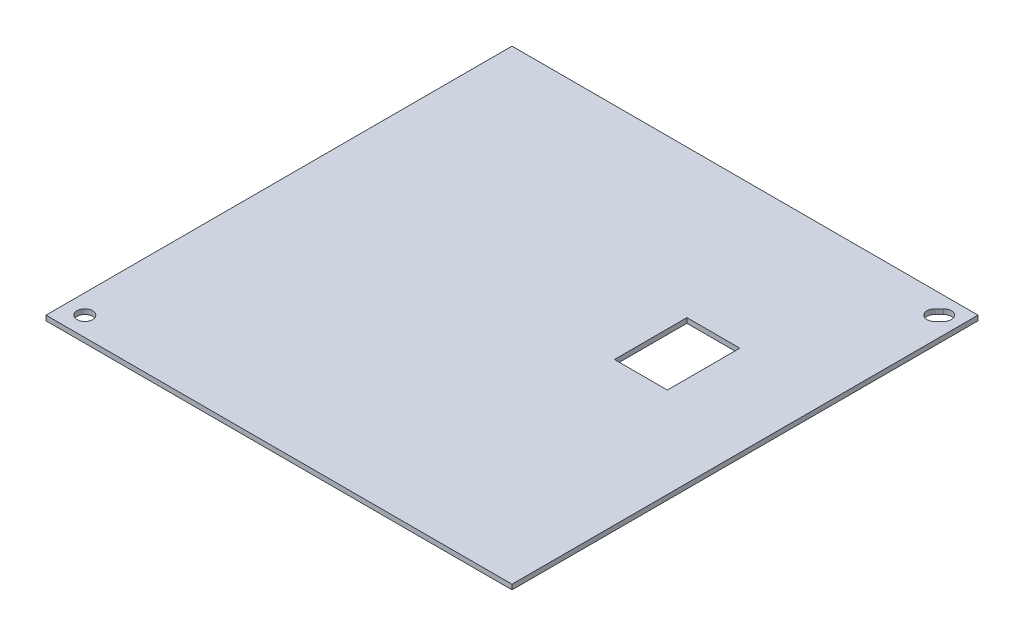
ISO-10303-21;
HEADER;
FILE_DESCRIPTION(('STEP AP214'),'2;1');
FILE_NAME('part.step','',(''),(''),'','','');
FILE_SCHEMA(('AUTOMOTIVE_DESIGN { 1 0 10303 214 1 1 1 1 }'));
ENDSEC;
DATA;
#1=APPLICATION_CONTEXT('core data for automotive mechanical design processes');
#2=APPLICATION_PROTOCOL_DEFINITION('international standard','automotive_design',2000,#1);
#3=PRODUCT_CONTEXT('',#1,'mechanical');
#4=PRODUCT('Part','Part','',(#3));
#5=PRODUCT_RELATED_PRODUCT_CATEGORY('part','',(#4));
#6=PRODUCT_DEFINITION_FORMATION('','',#4);
#7=PRODUCT_DEFINITION_CONTEXT('part definition',#1,'design');
#8=PRODUCT_DEFINITION('design','',#6,#7);
#9=PRODUCT_DEFINITION_SHAPE('','',#8);
#10=(LENGTH_UNIT() NAMED_UNIT(*) SI_UNIT(.MILLI.,.METRE.));
#11=(NAMED_UNIT(*) PLANE_ANGLE_UNIT() SI_UNIT($,.RADIAN.));
#12=(NAMED_UNIT(*) SI_UNIT($,.STERADIAN.) SOLID_ANGLE_UNIT());
#13=UNCERTAINTY_MEASURE_WITH_UNIT(LENGTH_MEASURE(1.E-05),#10,'distance_accuracy_value','');
#14=(GEOMETRIC_REPRESENTATION_CONTEXT(3) GLOBAL_UNCERTAINTY_ASSIGNED_CONTEXT((#13)) GLOBAL_UNIT_ASSIGNED_CONTEXT((#10,
#11,#12)) REPRESENTATION_CONTEXT('',''));
#15=CARTESIAN_POINT('',(0.,0.,0.));
#16=DIRECTION('',(0.,0.,1.));
#17=DIRECTION('',(1.,0.,0.));
#18=AXIS2_PLACEMENT_3D('',#15,#16,#17);
#19=CARTESIAN_POINT('',(150.,3.175,150.));
#20=DIRECTION('',(-1.,0.,0.));
#21=DIRECTION('',(0.,0.,1.));
#22=AXIS2_PLACEMENT_3D('',#19,#20,#21);
#23=PLANE('',#22);
#24=DIRECTION('',(0.,0.,-1.));
#25=VECTOR('',#24,1.);
#26=CARTESIAN_POINT('',(150.,0.,150.));
#27=LINE('',#26,#25);
#28=CARTESIAN_POINT('',(150.,0.,150.));
#29=VERTEX_POINT('',#28);
#30=CARTESIAN_POINT('',(150.,0.,-150.));
#31=VERTEX_POINT('',#30);
#32=EDGE_CURVE('E173',#29,#31,#27,.T.);
#33=ORIENTED_EDGE('',*,*,#32,.T.);
#34=DIRECTION('',(0.,-1.,0.));
#35=VECTOR('',#34,1.);
#36=CARTESIAN_POINT('',(150.,3.175,-150.));
#37=LINE('',#36,#35);
#38=CARTESIAN_POINT('',(150.,3.175,-150.));
#39=VERTEX_POINT('',#38);
#40=EDGE_CURVE('E11',#39,#31,#37,.T.);
#41=ORIENTED_EDGE('',*,*,#40,.F.);
#42=DIRECTION('',(0.,0.,-1.));
#43=VECTOR('',#42,1.);
#44=CARTESIAN_POINT('',(150.,3.175,150.));
#45=LINE('',#44,#43);
#46=CARTESIAN_POINT('',(150.,3.175,150.));
#47=VERTEX_POINT('',#46);
#48=EDGE_CURVE('E208',#47,#39,#45,.T.);
#49=ORIENTED_EDGE('',*,*,#48,.F.);
#50=DIRECTION('',(0.,-1.,0.));
#51=VECTOR('',#50,1.);
#52=CARTESIAN_POINT('',(150.,3.175,150.));
#53=LINE('',#52,#51);
#54=EDGE_CURVE('E218',#47,#29,#53,.T.);
#55=ORIENTED_EDGE('',*,*,#54,.T.);
#56=EDGE_LOOP('',(#33,#41,#49,#55));
#57=FACE_BOUND('',#56,.T.);
#58=ADVANCED_FACE('F45',(#57),#23,.F.);
#59=CARTESIAN_POINT('',(-150.,3.175,-150.));
#60=DIRECTION('',(0.,0.,1.));
#61=DIRECTION('',(1.,0.,0.));
#62=AXIS2_PLACEMENT_3D('',#59,#60,#61);
#63=PLANE('',#62);
#64=DIRECTION('',(-1.,0.,0.));
#65=VECTOR('',#64,1.);
#66=CARTESIAN_POINT('',(-150.,0.,-150.));
#67=LINE('',#66,#65);
#68=CARTESIAN_POINT('',(-150.,0.,-150.));
#69=VERTEX_POINT('',#68);
#70=EDGE_CURVE('E221',#31,#69,#67,.T.);
#71=ORIENTED_EDGE('',*,*,#70,.T.);
#72=DIRECTION('',(0.,-1.,0.));
#73=VECTOR('',#72,1.);
#74=CARTESIAN_POINT('',(-150.,3.175,-150.));
#75=LINE('',#74,#73);
#76=CARTESIAN_POINT('',(-150.,3.175,-150.));
#77=VERTEX_POINT('',#76);
#78=EDGE_CURVE('E52',#77,#69,#75,.T.);
#79=ORIENTED_EDGE('',*,*,#78,.F.);
#80=DIRECTION('',(-1.,0.,0.));
#81=VECTOR('',#80,1.);
#82=CARTESIAN_POINT('',(-150.,3.175,-150.));
#83=LINE('',#82,#81);
#84=EDGE_CURVE('E211',#39,#77,#83,.T.);
#85=ORIENTED_EDGE('',*,*,#84,.F.);
#86=ORIENTED_EDGE('',*,*,#40,.T.);
#87=EDGE_LOOP('',(#71,#79,#85,#86));
#88=FACE_BOUND('',#87,.T.);
#89=ADVANCED_FACE('F250',(#88),#63,.F.);
#90=CARTESIAN_POINT('',(-150.,3.175,150.));
#91=DIRECTION('',(1.,0.,0.));
#92=DIRECTION('',(0.,0.,-1.));
#93=AXIS2_PLACEMENT_3D('',#90,#91,#92);
#94=PLANE('',#93);
#95=DIRECTION('',(0.,0.,1.));
#96=VECTOR('',#95,1.);
#97=CARTESIAN_POINT('',(-150.,0.,150.));
#98=LINE('',#97,#96);
#99=CARTESIAN_POINT('',(-150.,0.,150.));
#100=VERTEX_POINT('',#99);
#101=EDGE_CURVE('E223',#69,#100,#98,.T.);
#102=ORIENTED_EDGE('',*,*,#101,.T.);
#103=DIRECTION('',(0.,-1.,0.));
#104=VECTOR('',#103,1.);
#105=CARTESIAN_POINT('',(-150.,3.175,150.));
#106=LINE('',#105,#104);
#107=CARTESIAN_POINT('',(-150.,3.175,150.));
#108=VERTEX_POINT('',#107);
#109=EDGE_CURVE('E228',#108,#100,#106,.T.);
#110=ORIENTED_EDGE('',*,*,#109,.F.);
#111=DIRECTION('',(0.,0.,1.));
#112=VECTOR('',#111,1.);
#113=CARTESIAN_POINT('',(-150.,3.175,150.));
#114=LINE('',#113,#112);
#115=EDGE_CURVE('E214',#77,#108,#114,.T.);
#116=ORIENTED_EDGE('',*,*,#115,.F.);
#117=ORIENTED_EDGE('',*,*,#78,.T.);
#118=EDGE_LOOP('',(#102,#110,#116,#117));
#119=FACE_BOUND('',#118,.T.);
#120=ADVANCED_FACE('F235',(#119),#94,.F.);
#121=CARTESIAN_POINT('',(-150.,3.175,150.));
#122=DIRECTION('',(0.,0.,-1.));
#123=DIRECTION('',(-1.,0.,0.));
#124=AXIS2_PLACEMENT_3D('',#121,#122,#123);
#125=PLANE('',#124);
#126=DIRECTION('',(1.,0.,0.));
#127=VECTOR('',#126,1.);
#128=CARTESIAN_POINT('',(-150.,0.,150.));
#129=LINE('',#128,#127);
#130=EDGE_CURVE('E212',#100,#29,#129,.T.);
#131=ORIENTED_EDGE('',*,*,#130,.T.);
#132=ORIENTED_EDGE('',*,*,#54,.F.);
#133=DIRECTION('',(1.,0.,0.));
#134=VECTOR('',#133,1.);
#135=CARTESIAN_POINT('',(-150.,3.175,150.));
#136=LINE('',#135,#134);
#137=EDGE_CURVE('E216',#108,#47,#136,.T.);
#138=ORIENTED_EDGE('',*,*,#137,.F.);
#139=ORIENTED_EDGE('',*,*,#109,.T.);
#140=EDGE_LOOP('',(#131,#132,#138,#139));
#141=FACE_BOUND('',#140,.T.);
#142=ADVANCED_FACE('F243',(#141),#125,.F.);
#143=CARTESIAN_POINT('',(0.,3.175,0.));
#144=DIRECTION('',(0.,-1.,0.));
#145=DIRECTION('',(0.,0.,-1.));
#146=AXIS2_PLACEMENT_3D('',#143,#144,#145);
#147=PLANE('',#146);
#148=DIRECTION('',(-1.,0.,0.));
#149=VECTOR('',#148,1.);
#150=CARTESIAN_POINT('',(57.6860126322791,3.175,-54.9271411369051));
#151=LINE('',#150,#149);
#152=CARTESIAN_POINT('',(91.7460126322791,3.175,-54.9271411369051));
#153=VERTEX_POINT('',#152);
#154=CARTESIAN_POINT('',(57.6860126322791,3.175,-54.9271411369051));
#155=VERTEX_POINT('',#154);
#156=EDGE_CURVE('E160',#153,#155,#151,.T.);
#157=ORIENTED_EDGE('',*,*,#156,.F.);
#158=DIRECTION('',(0.,0.,-1.));
#159=VECTOR('',#158,1.);
#160=CARTESIAN_POINT('',(91.7460126322791,3.175,-8.25714113690512));
#161=LINE('',#160,#159);
#162=CARTESIAN_POINT('',(91.7460126322791,3.175,-8.25714113690512));
#163=VERTEX_POINT('',#162);
#164=EDGE_CURVE('E59',#163,#153,#161,.T.);
#165=ORIENTED_EDGE('',*,*,#164,.F.);
#166=DIRECTION('',(1.,0.,0.));
#167=VECTOR('',#166,1.);
#168=CARTESIAN_POINT('',(57.6860126322791,3.175,-8.25714113690512));
#169=LINE('',#168,#167);
#170=CARTESIAN_POINT('',(57.6860126322791,3.175,-8.25714113690512));
#171=VERTEX_POINT('',#170);
#172=EDGE_CURVE('E151',#171,#163,#169,.T.);
#173=ORIENTED_EDGE('',*,*,#172,.F.);
#174=DIRECTION('',(0.,0.,1.));
#175=VECTOR('',#174,1.);
#176=CARTESIAN_POINT('',(57.6860126322791,3.175,-8.25714113690512));
#177=LINE('',#176,#175);
#178=EDGE_CURVE('E154',#155,#171,#177,.T.);
#179=ORIENTED_EDGE('',*,*,#178,.F.);
#180=EDGE_LOOP('',(#157,#165,#173,#179));
#181=FACE_BOUND('',#180,.T.);
#182=CARTESIAN_POINT('',(-137.5,3.175,137.5));
#183=DIRECTION('',(0.,1.,0.));
#184=DIRECTION('',(0.,0.,1.));
#185=AXIS2_PLACEMENT_3D('',#182,#183,#184);
#186=CIRCLE('',#185,4.99999999999999);
#187=CARTESIAN_POINT('',(-137.5,3.175,142.5));
#188=VERTEX_POINT('',#187);
#189=EDGE_CURVE('E174',#188,#188,#186,.T.);
#190=ORIENTED_EDGE('',*,*,#189,.F.);
#191=EDGE_LOOP('',(#190));
#192=FACE_BOUND('',#191,.T.);
#193=DIRECTION('',(-0.707106781186548,0.,0.707106781186548));
#194=VECTOR('',#193,1.);
#195=CARTESIAN_POINT('',(135.37867965644,3.175,-142.449747468306));
#196=LINE('',#195,#194);
#197=CARTESIAN_POINT('',(135.37867965644,3.175,-142.449747468306));
#198=VERTEX_POINT('',#197);
#199=CARTESIAN_POINT('',(132.550252531694,3.175,-139.62132034356));
#200=VERTEX_POINT('',#199);
#201=EDGE_CURVE('E194',#198,#200,#196,.T.);
#202=ORIENTED_EDGE('',*,*,#201,.F.);
#203=CARTESIAN_POINT('',(138.914213562373,3.175,-138.914213562373));
#204=DIRECTION('',(0.,1.,0.));
#205=DIRECTION('',(0.,0.,1.));
#206=AXIS2_PLACEMENT_3D('',#203,#204,#205);
#207=CIRCLE('',#206,5.);
#208=CARTESIAN_POINT('',(142.449747468306,3.175,-135.37867965644));
#209=VERTEX_POINT('',#208);
#210=EDGE_CURVE('E177',#209,#198,#207,.T.);
#211=ORIENTED_EDGE('',*,*,#210,.F.);
#212=DIRECTION('',(0.707106781186548,0.,-0.707106781186548));
#213=VECTOR('',#212,1.);
#214=CARTESIAN_POINT('',(142.449747468306,3.175,-135.37867965644));
#215=LINE('',#214,#213);
#216=CARTESIAN_POINT('',(139.62132034356,3.175,-132.550252531694));
#217=VERTEX_POINT('',#216);
#218=EDGE_CURVE('E187',#217,#209,#215,.T.);
#219=ORIENTED_EDGE('',*,*,#218,.F.);
#220=CARTESIAN_POINT('',(136.085786437627,3.175,-136.085786437627));
#221=DIRECTION('',(0.,1.,0.));
#222=DIRECTION('',(0.,0.,1.));
#223=AXIS2_PLACEMENT_3D('',#220,#221,#222);
#224=CIRCLE('',#223,5.);
#225=EDGE_CURVE('E190',#200,#217,#224,.T.);
#226=ORIENTED_EDGE('',*,*,#225,.F.);
#227=EDGE_LOOP('',(#202,#211,#219,#226));
#228=FACE_BOUND('',#227,.T.);
#229=ORIENTED_EDGE('',*,*,#48,.T.);
#230=ORIENTED_EDGE('',*,*,#84,.T.);
#231=ORIENTED_EDGE('',*,*,#115,.T.);
#232=ORIENTED_EDGE('',*,*,#137,.T.);
#233=EDGE_LOOP('',(#229,#230,#231,#232));
#234=FACE_BOUND('',#233,.T.);
#235=ADVANCED_FACE('F249',(#181,#192,#228,#234),#147,.F.);
#236=CARTESIAN_POINT('',(0.,0.,0.));
#237=DIRECTION('',(0.,-1.,0.));
#238=DIRECTION('',(0.,0.,-1.));
#239=AXIS2_PLACEMENT_3D('',#236,#237,#238);
#240=PLANE('',#239);
#241=DIRECTION('',(0.,0.,-1.));
#242=VECTOR('',#241,1.);
#243=CARTESIAN_POINT('',(91.7460126322791,0.,-8.25714113690512));
#244=LINE('',#243,#242);
#245=CARTESIAN_POINT('',(91.7460126322791,0.,-8.25714113690512));
#246=VERTEX_POINT('',#245);
#247=CARTESIAN_POINT('',(91.7460126322791,0.,-54.9271411369051));
#248=VERTEX_POINT('',#247);
#249=EDGE_CURVE('E135',#246,#248,#244,.T.);
#250=ORIENTED_EDGE('',*,*,#249,.T.);
#251=DIRECTION('',(-1.,0.,0.));
#252=VECTOR('',#251,1.);
#253=CARTESIAN_POINT('',(57.6860126322791,0.,-54.9271411369051));
#254=LINE('',#253,#252);
#255=CARTESIAN_POINT('',(57.6860126322791,0.,-54.9271411369051));
#256=VERTEX_POINT('',#255);
#257=EDGE_CURVE('E144',#248,#256,#254,.T.);
#258=ORIENTED_EDGE('',*,*,#257,.T.);
#259=DIRECTION('',(0.,0.,1.));
#260=VECTOR('',#259,1.);
#261=CARTESIAN_POINT('',(57.6860126322791,0.,-8.25714113690512));
#262=LINE('',#261,#260);
#263=CARTESIAN_POINT('',(57.6860126322791,0.,-8.25714113690512));
#264=VERTEX_POINT('',#263);
#265=EDGE_CURVE('E67',#256,#264,#262,.T.);
#266=ORIENTED_EDGE('',*,*,#265,.T.);
#267=DIRECTION('',(1.,0.,0.));
#268=VECTOR('',#267,1.);
#269=CARTESIAN_POINT('',(57.6860126322791,0.,-8.25714113690512));
#270=LINE('',#269,#268);
#271=EDGE_CURVE('E141',#264,#246,#270,.T.);
#272=ORIENTED_EDGE('',*,*,#271,.T.);
#273=EDGE_LOOP('',(#250,#258,#266,#272));
#274=FACE_BOUND('',#273,.T.);
#275=CARTESIAN_POINT('',(-137.5,0.,137.5));
#276=DIRECTION('',(0.,1.,0.));
#277=DIRECTION('',(0.,0.,1.));
#278=AXIS2_PLACEMENT_3D('',#275,#276,#277);
#279=CIRCLE('',#278,4.99999999999999);
#280=CARTESIAN_POINT('',(-137.5,0.,142.5));
#281=VERTEX_POINT('',#280);
#282=EDGE_CURVE('E170',#281,#281,#279,.T.);
#283=ORIENTED_EDGE('',*,*,#282,.T.);
#284=EDGE_LOOP('',(#283));
#285=FACE_BOUND('',#284,.T.);
#286=CARTESIAN_POINT('',(138.914213562373,0.,-138.914213562373));
#287=DIRECTION('',(0.,1.,0.));
#288=DIRECTION('',(0.,0.,1.));
#289=AXIS2_PLACEMENT_3D('',#286,#287,#288);
#290=CIRCLE('',#289,5.);
#291=CARTESIAN_POINT('',(142.449747468306,0.,-135.37867965644));
#292=VERTEX_POINT('',#291);
#293=CARTESIAN_POINT('',(135.37867965644,0.,-142.449747468306));
#294=VERTEX_POINT('',#293);
#295=EDGE_CURVE('E191',#292,#294,#290,.T.);
#296=ORIENTED_EDGE('',*,*,#295,.T.);
#297=DIRECTION('',(-0.707106781186548,0.,0.707106781186548));
#298=VECTOR('',#297,1.);
#299=CARTESIAN_POINT('',(135.37867965644,0.,-142.449747468306));
#300=LINE('',#299,#298);
#301=CARTESIAN_POINT('',(132.550252531694,0.,-139.62132034356));
#302=VERTEX_POINT('',#301);
#303=EDGE_CURVE('E203',#294,#302,#300,.T.);
#304=ORIENTED_EDGE('',*,*,#303,.T.);
#305=CARTESIAN_POINT('',(136.085786437627,0.,-136.085786437627));
#306=DIRECTION('',(0.,1.,0.));
#307=DIRECTION('',(0.,0.,1.));
#308=AXIS2_PLACEMENT_3D('',#305,#306,#307);
#309=CIRCLE('',#308,5.);
#310=CARTESIAN_POINT('',(139.62132034356,0.,-132.550252531694));
#311=VERTEX_POINT('',#310);
#312=EDGE_CURVE('E200',#302,#311,#309,.T.);
#313=ORIENTED_EDGE('',*,*,#312,.T.);
#314=DIRECTION('',(0.707106781186548,0.,-0.707106781186548));
#315=VECTOR('',#314,1.);
#316=CARTESIAN_POINT('',(142.449747468306,0.,-135.37867965644));
#317=LINE('',#316,#315);
#318=EDGE_CURVE('E181',#311,#292,#317,.T.);
#319=ORIENTED_EDGE('',*,*,#318,.T.);
#320=EDGE_LOOP('',(#296,#304,#313,#319));
#321=FACE_BOUND('',#320,.T.);
#322=ORIENTED_EDGE('',*,*,#32,.F.);
#323=ORIENTED_EDGE('',*,*,#130,.F.);
#324=ORIENTED_EDGE('',*,*,#101,.F.);
#325=ORIENTED_EDGE('',*,*,#70,.F.);
#326=EDGE_LOOP('',(#322,#323,#324,#325));
#327=FACE_BOUND('',#326,.T.);
#328=ADVANCED_FACE('F148',(#274,#285,#321,#327),#240,.T.);
#329=CARTESIAN_POINT('',(138.914213562373,0.,-138.914213562373));
#330=DIRECTION('',(0.,1.,0.));
#331=DIRECTION('',(0.,0.,1.));
#332=AXIS2_PLACEMENT_3D('',#329,#330,#331);
#333=CYLINDRICAL_SURFACE('',#332,5.);
#334=ORIENTED_EDGE('',*,*,#210,.T.);
#335=DIRECTION('',(0.,1.,0.));
#336=VECTOR('',#335,1.);
#337=CARTESIAN_POINT('',(135.37867965644,0.,-142.449747468306));
#338=LINE('',#337,#336);
#339=EDGE_CURVE('E178',#294,#198,#338,.T.);
#340=ORIENTED_EDGE('',*,*,#339,.F.);
#341=ORIENTED_EDGE('',*,*,#295,.F.);
#342=DIRECTION('',(0.,1.,0.));
#343=VECTOR('',#342,1.);
#344=CARTESIAN_POINT('',(142.449747468306,0.,-135.37867965644));
#345=LINE('',#344,#343);
#346=EDGE_CURVE('E166',#292,#209,#345,.T.);
#347=ORIENTED_EDGE('',*,*,#346,.T.);
#348=EDGE_LOOP('',(#334,#340,#341,#347));
#349=FACE_BOUND('',#348,.T.);
#350=ADVANCED_FACE('F262',(#349),#333,.F.);
#351=CARTESIAN_POINT('',(142.449747468306,0.,-135.37867965644));
#352=DIRECTION('',(0.707106781186548,0.,0.707106781186548));
#353=DIRECTION('',(0.707106781186548,0.,-0.707106781186548));
#354=AXIS2_PLACEMENT_3D('',#351,#352,#353);
#355=PLANE('',#354);
#356=ORIENTED_EDGE('',*,*,#218,.T.);
#357=ORIENTED_EDGE('',*,*,#346,.F.);
#358=ORIENTED_EDGE('',*,*,#318,.F.);
#359=DIRECTION('',(0.,1.,0.));
#360=VECTOR('',#359,1.);
#361=CARTESIAN_POINT('',(139.62132034356,0.,-132.550252531694));
#362=LINE('',#361,#360);
#363=EDGE_CURVE('E184',#311,#217,#362,.T.);
#364=ORIENTED_EDGE('',*,*,#363,.T.);
#365=EDGE_LOOP('',(#356,#357,#358,#364));
#366=FACE_BOUND('',#365,.T.);
#367=ADVANCED_FACE('F266',(#366),#355,.F.);
#368=CARTESIAN_POINT('',(136.085786437627,0.,-136.085786437627));
#369=DIRECTION('',(0.,1.,0.));
#370=DIRECTION('',(0.,0.,1.));
#371=AXIS2_PLACEMENT_3D('',#368,#369,#370);
#372=CYLINDRICAL_SURFACE('',#371,5.);
#373=ORIENTED_EDGE('',*,*,#225,.T.);
#374=ORIENTED_EDGE('',*,*,#363,.F.);
#375=ORIENTED_EDGE('',*,*,#312,.F.);
#376=DIRECTION('',(0.,1.,0.));
#377=VECTOR('',#376,1.);
#378=CARTESIAN_POINT('',(132.550252531694,0.,-139.62132034356));
#379=LINE('',#378,#377);
#380=EDGE_CURVE('E182',#302,#200,#379,.T.);
#381=ORIENTED_EDGE('',*,*,#380,.T.);
#382=EDGE_LOOP('',(#373,#374,#375,#381));
#383=FACE_BOUND('',#382,.T.);
#384=ADVANCED_FACE('F269',(#383),#372,.F.);
#385=CARTESIAN_POINT('',(135.37867965644,0.,-142.449747468306));
#386=DIRECTION('',(-0.707106781186548,0.,-0.707106781186548));
#387=DIRECTION('',(-0.707106781186548,0.,0.707106781186548));
#388=AXIS2_PLACEMENT_3D('',#385,#386,#387);
#389=PLANE('',#388);
#390=ORIENTED_EDGE('',*,*,#201,.T.);
#391=ORIENTED_EDGE('',*,*,#380,.F.);
#392=ORIENTED_EDGE('',*,*,#303,.F.);
#393=ORIENTED_EDGE('',*,*,#339,.T.);
#394=EDGE_LOOP('',(#390,#391,#392,#393));
#395=FACE_BOUND('',#394,.T.);
#396=ADVANCED_FACE('F273',(#395),#389,.F.);
#397=CARTESIAN_POINT('',(-137.5,0.,137.5));
#398=DIRECTION('',(0.,1.,0.));
#399=DIRECTION('',(0.,0.,1.));
#400=AXIS2_PLACEMENT_3D('',#397,#398,#399);
#401=CYLINDRICAL_SURFACE('',#400,4.99999999999999);
#402=ORIENTED_EDGE('',*,*,#282,.F.);
#403=EDGE_LOOP('',(#402));
#404=FACE_BOUND('',#403,.T.);
#405=ORIENTED_EDGE('',*,*,#189,.T.);
#406=EDGE_LOOP('',(#405));
#407=FACE_BOUND('',#406,.T.);
#408=ADVANCED_FACE('F277',(#404,#407),#401,.F.);
#409=CARTESIAN_POINT('',(91.7460126322791,0.,-8.25714113690512));
#410=DIRECTION('',(1.,0.,0.));
#411=DIRECTION('',(0.,0.,-1.));
#412=AXIS2_PLACEMENT_3D('',#409,#410,#411);
#413=PLANE('',#412);
#414=ORIENTED_EDGE('',*,*,#164,.T.);
#415=DIRECTION('',(0.,1.,0.));
#416=VECTOR('',#415,1.);
#417=CARTESIAN_POINT('',(91.7460126322791,0.,-54.9271411369051));
#418=LINE('',#417,#416);
#419=EDGE_CURVE('E131',#248,#153,#418,.T.);
#420=ORIENTED_EDGE('',*,*,#419,.F.);
#421=ORIENTED_EDGE('',*,*,#249,.F.);
#422=DIRECTION('',(0.,1.,0.));
#423=VECTOR('',#422,1.);
#424=CARTESIAN_POINT('',(91.7460126322791,0.,-8.25714113690512));
#425=LINE('',#424,#423);
#426=EDGE_CURVE('E164',#246,#163,#425,.T.);
#427=ORIENTED_EDGE('',*,*,#426,.T.);
#428=EDGE_LOOP('',(#414,#420,#421,#427));
#429=FACE_BOUND('',#428,.T.);
#430=ADVANCED_FACE('F133',(#429),#413,.F.);
#431=CARTESIAN_POINT('',(57.6860126322791,0.,-8.25714113690512));
#432=DIRECTION('',(0.,0.,1.));
#433=DIRECTION('',(1.,0.,0.));
#434=AXIS2_PLACEMENT_3D('',#431,#432,#433);
#435=PLANE('',#434);
#436=ORIENTED_EDGE('',*,*,#172,.T.);
#437=ORIENTED_EDGE('',*,*,#426,.F.);
#438=ORIENTED_EDGE('',*,*,#271,.F.);
#439=DIRECTION('',(0.,1.,0.));
#440=VECTOR('',#439,1.);
#441=CARTESIAN_POINT('',(57.6860126322791,0.,-8.25714113690512));
#442=LINE('',#441,#440);
#443=EDGE_CURVE('E167',#264,#171,#442,.T.);
#444=ORIENTED_EDGE('',*,*,#443,.T.);
#445=EDGE_LOOP('',(#436,#437,#438,#444));
#446=FACE_BOUND('',#445,.T.);
#447=ADVANCED_FACE('F287',(#446),#435,.F.);
#448=CARTESIAN_POINT('',(57.6860126322791,0.,-8.25714113690512));
#449=DIRECTION('',(-1.,0.,0.));
#450=DIRECTION('',(0.,0.,1.));
#451=AXIS2_PLACEMENT_3D('',#448,#449,#450);
#452=PLANE('',#451);
#453=ORIENTED_EDGE('',*,*,#178,.T.);
#454=ORIENTED_EDGE('',*,*,#443,.F.);
#455=ORIENTED_EDGE('',*,*,#265,.F.);
#456=DIRECTION('',(0.,1.,0.));
#457=VECTOR('',#456,1.);
#458=CARTESIAN_POINT('',(57.6860126322791,0.,-54.9271411369051));
#459=LINE('',#458,#457);
#460=EDGE_CURVE('E140',#256,#155,#459,.T.);
#461=ORIENTED_EDGE('',*,*,#460,.T.);
#462=EDGE_LOOP('',(#453,#454,#455,#461));
#463=FACE_BOUND('',#462,.T.);
#464=ADVANCED_FACE('F290',(#463),#452,.F.);
#465=CARTESIAN_POINT('',(57.6860126322791,0.,-54.9271411369051));
#466=DIRECTION('',(0.,0.,-1.));
#467=DIRECTION('',(-1.,0.,0.));
#468=AXIS2_PLACEMENT_3D('',#465,#466,#467);
#469=PLANE('',#468);
#470=ORIENTED_EDGE('',*,*,#156,.T.);
#471=ORIENTED_EDGE('',*,*,#460,.F.);
#472=ORIENTED_EDGE('',*,*,#257,.F.);
#473=ORIENTED_EDGE('',*,*,#419,.T.);
#474=EDGE_LOOP('',(#470,#471,#472,#473));
#475=FACE_BOUND('',#474,.T.);
#476=ADVANCED_FACE('F145',(#475),#469,.F.);
#477=CLOSED_SHELL('',(#58,#89,#120,#142,#235,#328,#350,#367,#384,#396,#408,#430,#447,#464,#476));
#478=MANIFOLD_SOLID_BREP('B2',#477);
#479=ADVANCED_BREP_SHAPE_REPRESENTATION('',(#18,#478),#14);
#480=SHAPE_DEFINITION_REPRESENTATION(#9,#479);
ENDSEC;
END-ISO-10303-21;
